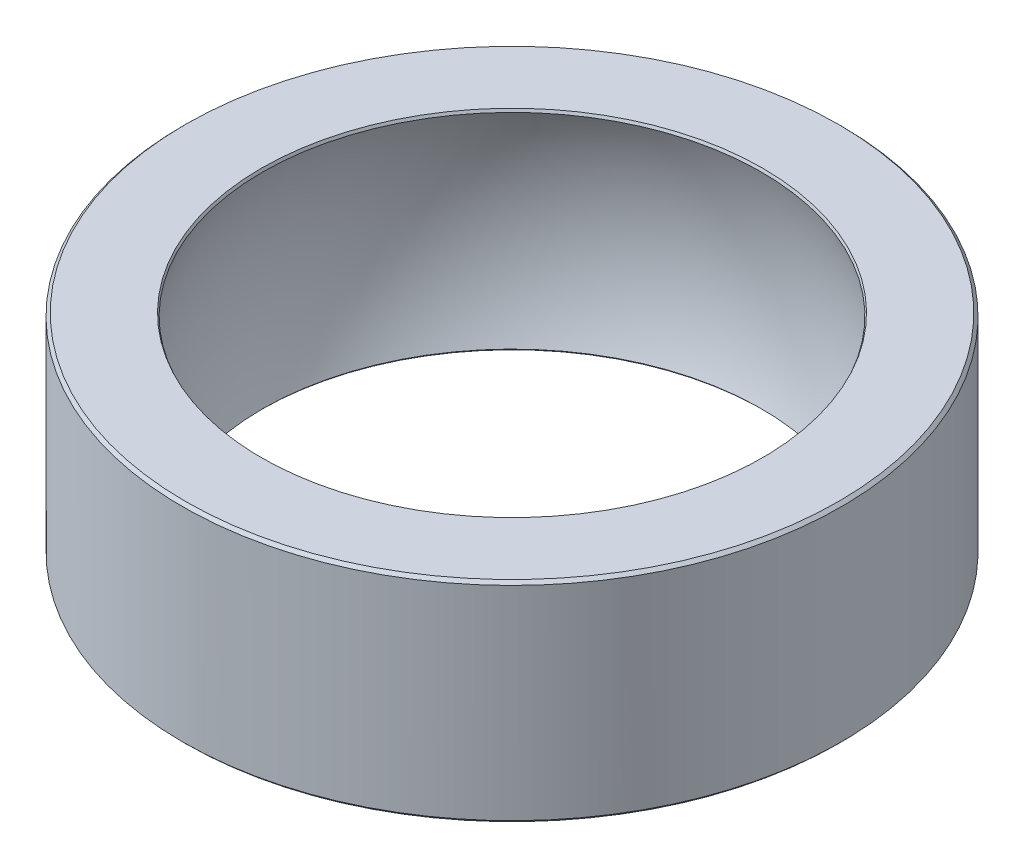
ISO-10303-21;
HEADER;
FILE_DESCRIPTION(('STEP AP214'),'2;1');
FILE_NAME('part.step','',(''),(''),'','','');
FILE_SCHEMA(('AUTOMOTIVE_DESIGN { 1 0 10303 214 1 1 1 1 }'));
ENDSEC;
DATA;
#1=APPLICATION_CONTEXT('core data for automotive mechanical design processes');
#2=APPLICATION_PROTOCOL_DEFINITION('international standard','automotive_design',2000,#1);
#3=PRODUCT_CONTEXT('',#1,'mechanical');
#4=PRODUCT('Part','Part','',(#3));
#5=PRODUCT_RELATED_PRODUCT_CATEGORY('part','',(#4));
#6=PRODUCT_DEFINITION_FORMATION('','',#4);
#7=PRODUCT_DEFINITION_CONTEXT('part definition',#1,'design');
#8=PRODUCT_DEFINITION('design','',#6,#7);
#9=PRODUCT_DEFINITION_SHAPE('','',#8);
#10=(LENGTH_UNIT() NAMED_UNIT(*) SI_UNIT(.MILLI.,.METRE.));
#11=(NAMED_UNIT(*) PLANE_ANGLE_UNIT() SI_UNIT($,.RADIAN.));
#12=(NAMED_UNIT(*) SI_UNIT($,.STERADIAN.) SOLID_ANGLE_UNIT());
#13=UNCERTAINTY_MEASURE_WITH_UNIT(LENGTH_MEASURE(1.E-05),#10,'distance_accuracy_value','');
#14=(GEOMETRIC_REPRESENTATION_CONTEXT(3) GLOBAL_UNCERTAINTY_ASSIGNED_CONTEXT((#13)) GLOBAL_UNIT_ASSIGNED_CONTEXT((#10,
#11,#12)) REPRESENTATION_CONTEXT('',''));
#15=CARTESIAN_POINT('',(0.,0.,0.));
#16=DIRECTION('',(0.,0.,1.));
#17=DIRECTION('',(1.,0.,0.));
#18=AXIS2_PLACEMENT_3D('',#15,#16,#17);
#19=CARTESIAN_POINT('',(-11.,3.5,0.));
#20=DIRECTION('',(0.,-1.,0.));
#21=DIRECTION('',(0.,0.,-1.));
#22=AXIS2_PLACEMENT_3D('',#19,#20,#21);
#23=PLANE('',#22);
#24=CARTESIAN_POINT('',(0.,3.5,0.));
#25=DIRECTION('',(0.,-1.,0.));
#26=DIRECTION('',(0.,0.,-1.));
#27=AXIS2_PLACEMENT_3D('',#24,#25,#26);
#28=CIRCLE('',#27,8.3678877418761);
#29=CARTESIAN_POINT('',(0.,3.5,-8.3678877418761));
#30=VERTEX_POINT('',#29);
#31=EDGE_CURVE('E41',#30,#30,#28,.T.);
#32=ORIENTED_EDGE('',*,*,#31,.T.);
#33=EDGE_LOOP('',(#32));
#34=FACE_BOUND('',#33,.T.);
#35=CARTESIAN_POINT('',(0.,3.5,0.));
#36=DIRECTION('',(0.,-1.,0.));
#37=DIRECTION('',(0.,0.,-1.));
#38=AXIS2_PLACEMENT_3D('',#35,#36,#37);
#39=CIRCLE('',#38,10.9);
#40=CARTESIAN_POINT('',(0.,3.5,-10.9));
#41=VERTEX_POINT('',#40);
#42=EDGE_CURVE('E45',#41,#41,#39,.F.);
#43=ORIENTED_EDGE('',*,*,#42,.T.);
#44=EDGE_LOOP('',(#43));
#45=FACE_BOUND('',#44,.T.);
#46=ADVANCED_FACE('F30',(#34,#45),#23,.F.);
#47=CARTESIAN_POINT('',(0.,0.,0.));
#48=DIRECTION('',(0.,-1.,0.));
#49=DIRECTION('',(0.,0.,-1.));
#50=AXIS2_PLACEMENT_3D('',#47,#48,#49);
#51=CYLINDRICAL_SURFACE('',#50,11.);
#52=CARTESIAN_POINT('',(0.,3.4,0.));
#53=DIRECTION('',(0.,-1.,0.));
#54=DIRECTION('',(0.,0.,-1.));
#55=AXIS2_PLACEMENT_3D('',#52,#53,#54);
#56=CIRCLE('',#55,11.);
#57=CARTESIAN_POINT('',(0.,3.4,-11.));
#58=VERTEX_POINT('',#57);
#59=EDGE_CURVE('E10',#58,#58,#56,.T.);
#60=ORIENTED_EDGE('',*,*,#59,.T.);
#61=EDGE_LOOP('',(#60));
#62=FACE_BOUND('',#61,.T.);
#63=CARTESIAN_POINT('',(0.,-3.4,0.));
#64=DIRECTION('',(0.,1.,0.));
#65=DIRECTION('',(0.,0.,1.));
#66=AXIS2_PLACEMENT_3D('',#63,#64,#65);
#67=CIRCLE('',#66,11.);
#68=CARTESIAN_POINT('',(0.,-3.4,11.));
#69=VERTEX_POINT('',#68);
#70=EDGE_CURVE('E37',#69,#69,#67,.T.);
#71=ORIENTED_EDGE('',*,*,#70,.T.);
#72=EDGE_LOOP('',(#71));
#73=FACE_BOUND('',#72,.T.);
#74=ADVANCED_FACE('F75',(#62,#73),#51,.T.);
#75=CARTESIAN_POINT('',(-11.,-3.5,0.));
#76=DIRECTION('',(0.,1.,0.));
#77=DIRECTION('',(0.,0.,1.));
#78=AXIS2_PLACEMENT_3D('',#75,#76,#77);
#79=PLANE('',#78);
#80=CARTESIAN_POINT('',(0.,-3.5,0.));
#81=DIRECTION('',(0.,1.,0.));
#82=DIRECTION('',(0.,0.,1.));
#83=AXIS2_PLACEMENT_3D('',#80,#81,#82);
#84=CIRCLE('',#83,8.3915619758885);
#85=CARTESIAN_POINT('',(0.,-3.5,8.3915619758885));
#86=VERTEX_POINT('',#85);
#87=EDGE_CURVE('E50',#86,#86,#84,.T.);
#88=ORIENTED_EDGE('',*,*,#87,.T.);
#89=EDGE_LOOP('',(#88));
#90=FACE_BOUND('',#89,.T.);
#91=CARTESIAN_POINT('',(0.,-3.5,0.));
#92=DIRECTION('',(0.,1.,0.));
#93=DIRECTION('',(0.,0.,1.));
#94=AXIS2_PLACEMENT_3D('',#91,#92,#93);
#95=CIRCLE('',#94,10.9);
#96=CARTESIAN_POINT('',(0.,-3.5,10.9));
#97=VERTEX_POINT('',#96);
#98=EDGE_CURVE('E53',#97,#97,#95,.F.);
#99=ORIENTED_EDGE('',*,*,#98,.T.);
#100=EDGE_LOOP('',(#99));
#101=FACE_BOUND('',#100,.T.);
#102=ADVANCED_FACE('F91',(#90,#101),#79,.F.);
#103=CARTESIAN_POINT('',(0.,0.,0.));
#104=DIRECTION('',(0.,-1.,0.));
#105=DIRECTION('',(-1.,0.,0.));
#106=AXIS2_PLACEMENT_3D('',#103,#104,#105);
#107=SPHERICAL_SURFACE('',#106,9.);
#108=CARTESIAN_POINT('',(0.,-3.42943435781206,0.));
#109=DIRECTION('',(0.,1.,0.));
#110=DIRECTION('',(0.,0.,1.));
#111=AXIS2_PLACEMENT_3D('',#108,#109,#110);
#112=CIRCLE('',#111,8.32099633370056);
#113=CARTESIAN_POINT('',(-8.32099633370056,-3.42943435781206,0.));
#114=VERTEX_POINT('',#113);
#115=EDGE_CURVE('E56',#114,#114,#112,.F.);
#116=CARTESIAN_POINT('',(0.,3.40713543457549,0.));
#117=DIRECTION('',(0.,-1.,0.));
#118=DIRECTION('',(0.,0.,-1.));
#119=AXIS2_PLACEMENT_3D('',#116,#117,#118);
#120=CIRCLE('',#119,8.33015174714484);
#121=CARTESIAN_POINT('',(-8.33015174714484,3.40713543457549,0.));
#122=VERTEX_POINT('',#121);
#123=EDGE_CURVE('E59',#122,#122,#120,.F.);
#124=CARTESIAN_POINT('',(-8.32099633370056,-3.42943435781206,0.));
#125=CARTESIAN_POINT('',(-8.34883141806793,-3.36189729277545,0.));
#126=CARTESIAN_POINT('',(-8.37584391075943,-3.29402121157113,0.));
#127=CARTESIAN_POINT('',(-8.42820847441201,-3.15763155624071,0.));
#128=CARTESIAN_POINT('',(-8.45356054537308,-3.08911798211461,0.));
#129=CARTESIAN_POINT('',(-8.50258902718614,-2.95149388035427,0.));
#130=CARTESIAN_POINT('',(-8.52626543803812,-2.88238335272003,0.));
#131=CARTESIAN_POINT('',(-8.57192861846479,-2.74360633854039,0.));
#132=CARTESIAN_POINT('',(-8.59391538803948,-2.67393985199498,0.));
#133=CARTESIAN_POINT('',(-8.636186235795,-2.53409221706301,0.));
#134=CARTESIAN_POINT('',(-8.65647031397583,-2.46391106867645,0.));
#135=CARTESIAN_POINT('',(-8.69532375723065,-2.32307571952798,0.));
#136=CARTESIAN_POINT('',(-8.71389312230464,-2.25242151876606,0.));
#137=CARTESIAN_POINT('',(-8.7493061291514,-2.11068195284051,0.));
#138=CARTESIAN_POINT('',(-8.76614977092415,-2.03959658767687,0.));
#139=CARTESIAN_POINT('',(-8.79810134545423,-1.89703683706573,0.));
#140=CARTESIAN_POINT('',(-8.81320927821156,-1.82556245161821,0.));
#141=CARTESIAN_POINT('',(-8.84168047767293,-1.6822670350537,0.));
#142=CARTESIAN_POINT('',(-8.85504374437699,-1.6104460039367,0.));
#143=CARTESIAN_POINT('',(-8.88001768914265,-1.46649987619906,0.));
#144=CARTESIAN_POINT('',(-8.89162836720424,-1.39437477957842,0.));
#145=CARTESIAN_POINT('',(-8.91309025111766,-1.24986328125906,0.));
#146=CARTESIAN_POINT('',(-8.92294145696947,-1.17747687956033,0.));
#147=CARTESIAN_POINT('',(-8.94087855603207,-1.03248568643159,0.));
#148=CARTESIAN_POINT('',(-8.94896444924285,-0.959880895001565,0.));
#149=CARTESIAN_POINT('',(-8.9633661291819,-0.814495967231885,0.));
#150=CARTESIAN_POINT('',(-8.96968191591017,-0.741715830892226,0.));
#151=CARTESIAN_POINT('',(-8.98053963847694,-0.596023362080931,0.));
#152=CARTESIAN_POINT('',(-8.98508157431545,-0.523111029609296,0.));
#153=CARTESIAN_POINT('',(-8.99238890234901,-0.377197395686089,0.));
#154=CARTESIAN_POINT('',(-8.99515429454406,-0.304196094234518,0.));
#155=CARTESIAN_POINT('',(-8.99890689578714,-0.158147802250064,0.));
#156=CARTESIAN_POINT('',(-8.99989410483518,-0.0851008117171809,0.));
#157=CARTESIAN_POINT('',(-9.00008975450278,0.060995551443828,0.));
#158=CARTESIAN_POINT('',(-8.99929819512236,0.134044924071954,0.));
#159=CARTESIAN_POINT('',(-8.99593677722069,0.280102743025122,0.));
#160=CARTESIAN_POINT('',(-8.99336691869945,0.353111189350164,0.));
#161=CARTESIAN_POINT('',(-8.9864504260947,0.499043871562594,0.));
#162=CARTESIAN_POINT('',(-8.9821037920112,0.571968107449982,0.));
#163=CARTESIAN_POINT('',(-8.97163632524808,0.71768913457795,0.));
#164=CARTESIAN_POINT('',(-8.96551549256847,0.79048592581853,0.));
#165=CARTESIAN_POINT('',(-8.951503257439,0.935908905001115,0.));
#166=CARTESIAN_POINT('',(-8.94361185498915,1.00853509294312,0.));
#167=CARTESIAN_POINT('',(-8.92606315885397,1.15357380802166,0.));
#168=CARTESIAN_POINT('',(-8.91640586516863,1.2259863351582,0.));
#169=CARTESIAN_POINT('',(-8.89533111203006,1.37055479779016,0.));
#170=CARTESIAN_POINT('',(-8.88391365257682,1.44271073328558,0.));
#171=CARTESIAN_POINT('',(-8.85932533691724,1.58672323392647,0.));
#172=CARTESIAN_POINT('',(-8.8461544807109,1.65857979907194,0.));
#173=CARTESIAN_POINT('',(-8.81806718006091,1.80195095778026,0.));
#174=CARTESIAN_POINT('',(-8.80315073561725,1.8734655513431,0.));
#175=CARTESIAN_POINT('',(-8.77158110200386,2.01611036843359,0.));
#176=CARTESIAN_POINT('',(-8.75492791283413,2.08724059196124,0.));
#177=CARTESIAN_POINT('',(-8.71989466256984,2.22907449826933,0.));
#178=CARTESIAN_POINT('',(-8.70151460147529,2.29977818104977,0.));
#179=CARTESIAN_POINT('',(-8.66303850532521,2.44071708855078,0.));
#180=CARTESIAN_POINT('',(-8.64294247026969,2.51095231327136,0.));
#181=CARTESIAN_POINT('',(-8.60104633642241,2.65091266313761,0.));
#182=CARTESIAN_POINT('',(-8.57924623763065,2.7206377882833,0.));
#183=CARTESIAN_POINT('',(-8.53395491577224,2.85953660712498,0.));
#184=CARTESIAN_POINT('',(-8.51046369270559,2.92871030082097,0.));
#185=CARTESIAN_POINT('',(-8.46180399361716,3.06646522486675,0.));
#186=CARTESIAN_POINT('',(-8.43663551759538,3.13504645521653,0.));
#187=CARTESIAN_POINT('',(-8.38463644234157,3.27157587248777,0.));
#188=CARTESIAN_POINT('',(-8.35780584310954,3.33952405940923,0.));
#189=CARTESIAN_POINT('',(-8.33015174714484,3.40713543457549,0.));
#190=B_SPLINE_CURVE_WITH_KNOTS('',3,(#124,#125,#126,#127,#128,#129,#130,#131,#132,#133,#134,
#135,#136,#137,#138,#139,#140,#141,#142,#143,#144,#145,#146,#147,#148,#149,#150,#151,#152,#153,
#154,#155,#156,#157,#158,#159,#160,#161,#162,#163,#164,#165,#166,#167,#168,#169,#170,#171,#172,
#173,#174,#175,#176,#177,#178,#179,#180,#181,#182,#183,#184,#185,#186,#187,#188,#189),
.UNSPECIFIED.,.F.,.F.,(4,2,2,2,2,2,2,2,2,2,2,2,2,2,2,2,2,2,2,2,2,2,2,2,2,2,2,2,2,2,2,2,4),(0.,
0.219139327983615,0.43827865596723,0.657417983950845,0.87655731193446,1.09569663991807,
1.31483596790169,1.5339752958853,1.75311462386892,1.97225395185253,2.19139327983615,
2.41053260781976,2.62967193580338,2.84881126378699,3.06795059177061,3.28708991975422,
3.50622924773784,3.72536857572145,3.94450790370507,4.16364723168868,4.3827865596723,
4.60192588765591,4.82106521563953,5.04020454362314,5.25934387160676,5.47848319959037,
5.69762252757399,5.9167618555576,6.13590118354122,6.35504051152483,6.57417983950845,
6.79331916749206,7.01245849547568),.UNSPECIFIED.);
#191=EDGE_CURVE('BSEAM63',#114,#122,#190,.T.);
#192=ORIENTED_EDGE('',*,*,#115,.T.);
#193=ORIENTED_EDGE('',*,*,#123,.T.);
#194=ORIENTED_EDGE('',*,*,#191,.T.);
#195=ORIENTED_EDGE('',*,*,#191,.F.);
#196=EDGE_LOOP('',(#192,#194,#193,#195));
#197=FACE_BOUND('',#196,.T.);
#198=ADVANCED_FACE('F63',(#197),#107,.F.);
#199=CARTESIAN_POINT('',(0.,-3.42943435781206,0.));
#200=DIRECTION('',(0.,-1.,0.));
#201=DIRECTION('',(0.,0.,-1.));
#202=AXIS2_PLACEMENT_3D('',#199,#200,#201);
#203=CONICAL_SURFACE('',#202,8.32099633370056,0.78539816339743);
#204=ORIENTED_EDGE('',*,*,#87,.F.);
#205=EDGE_LOOP('',(#204));
#206=FACE_BOUND('',#205,.T.);
#207=ORIENTED_EDGE('',*,*,#115,.F.);
#208=EDGE_LOOP('',(#207));
#209=FACE_BOUND('',#208,.T.);
#210=ADVANCED_FACE('F69',(#206,#209),#203,.F.);
#211=CARTESIAN_POINT('',(0.,3.5,0.));
#212=DIRECTION('',(0.,1.,0.));
#213=DIRECTION('',(0.,0.,1.));
#214=AXIS2_PLACEMENT_3D('',#211,#212,#213);
#215=CONICAL_SURFACE('',#214,8.3678877418761,0.385972923516857);
#216=ORIENTED_EDGE('',*,*,#123,.F.);
#217=EDGE_LOOP('',(#216));
#218=FACE_BOUND('',#217,.T.);
#219=ORIENTED_EDGE('',*,*,#31,.F.);
#220=EDGE_LOOP('',(#219));
#221=FACE_BOUND('',#220,.T.);
#222=ADVANCED_FACE('F65',(#218,#221),#215,.F.);
#223=CARTESIAN_POINT('',(0.,3.4,0.));
#224=DIRECTION('',(0.,-1.,0.));
#225=DIRECTION('',(0.,0.,-1.));
#226=AXIS2_PLACEMENT_3D('',#223,#224,#225);
#227=CONICAL_SURFACE('',#226,11.,0.78539816339744);
#228=ORIENTED_EDGE('',*,*,#42,.F.);
#229=EDGE_LOOP('',(#228));
#230=FACE_BOUND('',#229,.T.);
#231=ORIENTED_EDGE('',*,*,#59,.F.);
#232=EDGE_LOOP('',(#231));
#233=FACE_BOUND('',#232,.T.);
#234=ADVANCED_FACE('F68',(#230,#233),#227,.T.);
#235=CARTESIAN_POINT('',(0.,-3.5,0.));
#236=DIRECTION('',(0.,1.,0.));
#237=DIRECTION('',(0.,0.,1.));
#238=AXIS2_PLACEMENT_3D('',#235,#236,#237);
#239=CONICAL_SURFACE('',#238,10.9,0.785398163397448);
#240=ORIENTED_EDGE('',*,*,#70,.F.);
#241=EDGE_LOOP('',(#240));
#242=FACE_BOUND('',#241,.T.);
#243=ORIENTED_EDGE('',*,*,#98,.F.);
#244=EDGE_LOOP('',(#243));
#245=FACE_BOUND('',#244,.T.);
#246=ADVANCED_FACE('F32',(#242,#245),#239,.T.);
#247=CLOSED_SHELL('',(#46,#74,#102,#198,#210,#222,#234,#246));
#248=MANIFOLD_SOLID_BREP('B2',#247);
#249=ADVANCED_BREP_SHAPE_REPRESENTATION('',(#18,#248),#14);
#250=SHAPE_DEFINITION_REPRESENTATION(#9,#249);
ENDSEC;
END-ISO-10303-21;
